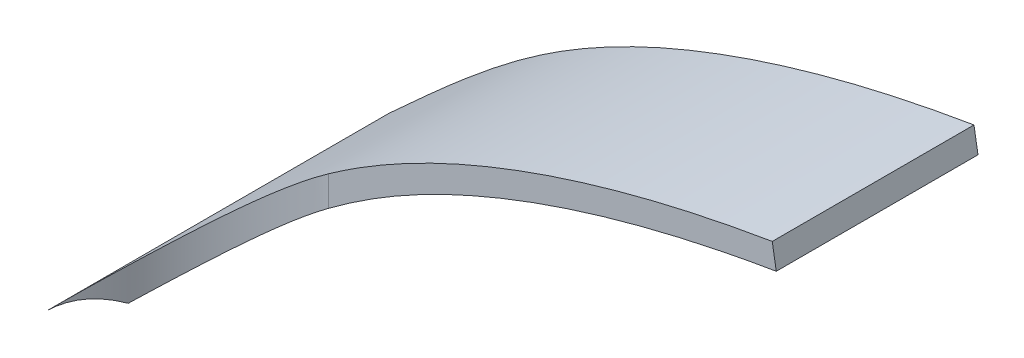
ISO-10303-21;
HEADER;
FILE_DESCRIPTION(('STEP AP214'),'2;1');
FILE_NAME('part.step','',(''),(''),'','','');
FILE_SCHEMA(('AUTOMOTIVE_DESIGN { 1 0 10303 214 1 1 1 1 }'));
ENDSEC;
DATA;
#1=APPLICATION_CONTEXT('core data for automotive mechanical design processes');
#2=APPLICATION_PROTOCOL_DEFINITION('international standard','automotive_design',2000,#1);
#3=PRODUCT_CONTEXT('',#1,'mechanical');
#4=PRODUCT('Part','Part','',(#3));
#5=PRODUCT_RELATED_PRODUCT_CATEGORY('part','',(#4));
#6=PRODUCT_DEFINITION_FORMATION('','',#4);
#7=PRODUCT_DEFINITION_CONTEXT('part definition',#1,'design');
#8=PRODUCT_DEFINITION('design','',#6,#7);
#9=PRODUCT_DEFINITION_SHAPE('','',#8);
#10=(LENGTH_UNIT() NAMED_UNIT(*) SI_UNIT(.MILLI.,.METRE.));
#11=(NAMED_UNIT(*) PLANE_ANGLE_UNIT() SI_UNIT($,.RADIAN.));
#12=(NAMED_UNIT(*) SI_UNIT($,.STERADIAN.) SOLID_ANGLE_UNIT());
#13=UNCERTAINTY_MEASURE_WITH_UNIT(LENGTH_MEASURE(1.E-05),#10,'distance_accuracy_value','');
#14=(GEOMETRIC_REPRESENTATION_CONTEXT(3) GLOBAL_UNCERTAINTY_ASSIGNED_CONTEXT((#13)) GLOBAL_UNIT_ASSIGNED_CONTEXT((#10,
#11,#12)) REPRESENTATION_CONTEXT('',''));
#15=CARTESIAN_POINT('',(0.,0.,0.));
#16=DIRECTION('',(0.,0.,1.));
#17=DIRECTION('',(1.,0.,0.));
#18=AXIS2_PLACEMENT_3D('',#15,#16,#17);
#19=CARTESIAN_POINT('',(0.,17.,10.));
#20=CARTESIAN_POINT('',(-1.92387366551589,16.6771904581056,10.));
#21=CARTESIAN_POINT('',(-5.62048772460826,15.8091540081434,10.));
#22=CARTESIAN_POINT('',(-10.6672018109282,13.5202587298351,10.));
#23=CARTESIAN_POINT('',(-13.2757006839175,11.1183251769361,10.));
#24=CARTESIAN_POINT('',(-14.5,10.,10.));
#25=B_SPLINE_CURVE_WITH_KNOTS('',3,(#19,#20,#21,#22,#23,#24),.UNSPECIFIED.,.F.,.F.,(4,1,1,4),
(0.,0.35691261152132,0.695162256038272,1.),.UNSPECIFIED.);
#26=DIRECTION('',(0.,0.,-1.));
#27=VECTOR('',#26,1.);
#28=SURFACE_OF_LINEAR_EXTRUSION('',#25,#27);
#29=CARTESIAN_POINT('',(0.,17.,5.));
#30=CARTESIAN_POINT('',(-1.92387366551589,16.6771904581056,5.));
#31=CARTESIAN_POINT('',(-5.62048772460826,15.8091540081434,5.));
#32=CARTESIAN_POINT('',(-10.6672018109282,13.5202587298351,5.));
#33=CARTESIAN_POINT('',(-13.2757006839175,11.1183251769361,5.));
#34=CARTESIAN_POINT('',(-14.5,10.,5.));
#35=B_SPLINE_CURVE_WITH_KNOTS('',3,(#29,#30,#31,#32,#33,#34),.UNSPECIFIED.,.F.,.F.,(4,1,1,4),
(0.,0.35691261152132,0.695162256038272,1.),.UNSPECIFIED.);
#36=CARTESIAN_POINT('',(0.,17.,5.));
#37=VERTEX_POINT('',#36);
#38=CARTESIAN_POINT('',(-11.,12.9510138024321,5.));
#39=VERTEX_POINT('',#38);
#40=EDGE_CURVE('E106',#37,#39,#35,.T.);
#41=ORIENTED_EDGE('',*,*,#40,.F.);
#42=DIRECTION('',(0.,0.,-1.));
#43=VECTOR('',#42,1.);
#44=CARTESIAN_POINT('',(0.,17.,10.));
#45=LINE('',#44,#43);
#46=CARTESIAN_POINT('',(0.,17.,0.));
#47=VERTEX_POINT('',#46);
#48=EDGE_CURVE('E64',#37,#47,#45,.T.);
#49=ORIENTED_EDGE('',*,*,#48,.T.);
#50=CARTESIAN_POINT('',(0.,17.,0.));
#51=CARTESIAN_POINT('',(-1.92387366551589,16.6771904581056,0.));
#52=CARTESIAN_POINT('',(-5.62048772460826,15.8091540081434,0.));
#53=CARTESIAN_POINT('',(-10.6672018109282,13.5202587298351,0.));
#54=CARTESIAN_POINT('',(-13.2757006839175,11.1183251769361,0.));
#55=CARTESIAN_POINT('',(-14.5,10.,0.));
#56=B_SPLINE_CURVE_WITH_KNOTS('',3,(#50,#51,#52,#53,#54,#55),.UNSPECIFIED.,.F.,.F.,(4,1,1,4),
(0.,0.35691261152132,0.695162256038272,1.),.UNSPECIFIED.);
#57=CARTESIAN_POINT('',(-14.5,10.,0.));
#58=VERTEX_POINT('',#57);
#59=EDGE_CURVE('E97',#47,#58,#56,.T.);
#60=ORIENTED_EDGE('',*,*,#59,.T.);
#61=DIRECTION('',(0.,0.,-1.));
#62=VECTOR('',#61,1.);
#63=CARTESIAN_POINT('',(-14.5,10.,10.));
#64=LINE('',#63,#62);
#65=CARTESIAN_POINT('',(-14.5,10.,8.5));
#66=VERTEX_POINT('',#65);
#67=EDGE_CURVE('E103',#66,#58,#64,.T.);
#68=ORIENTED_EDGE('',*,*,#67,.F.);
#69=CARTESIAN_POINT('',(-11.,12.9510138024321,5.));
#70=CARTESIAN_POINT('',(-11.1207210362699,12.8653711583919,5.00002826827791));
#71=CARTESIAN_POINT('',(-11.2403272775594,12.7782434289402,5.00624533008585));
#72=CARTESIAN_POINT('',(-11.476754067087,12.6019953960518,5.0305805153093));
#73=CARTESIAN_POINT('',(-11.5935758533821,12.5128760136582,5.048693243234));
#74=CARTESIAN_POINT('',(-11.8249299275096,12.3328098006543,5.09653891952134));
#75=CARTESIAN_POINT('',(-11.9394356862005,12.2418539860986,5.12636566677282));
#76=CARTESIAN_POINT('',(-12.1647725867874,12.0597652675851,5.19738482108524));
#77=CARTESIAN_POINT('',(-12.2756027599258,11.9686323235375,5.23858019827255));
#78=CARTESIAN_POINT('',(-12.495961058285,11.784830877574,5.33347739363892));
#79=CARTESIAN_POINT('',(-12.6053793329101,11.6921845458931,5.38747810515986));
#80=CARTESIAN_POINT('',(-12.8192345308152,11.5089613414559,5.50744041415602));
#81=CARTESIAN_POINT('',(-12.9236729643964,11.4183838456548,5.57339835568795));
#82=CARTESIAN_POINT('',(-13.1264668957097,11.2408894166357,5.71727880078463));
#83=CARTESIAN_POINT('',(-13.2248433687233,11.1539602366916,5.79515637116654));
#84=CARTESIAN_POINT('',(-13.4149896702411,10.9848087540005,5.96347459123423));
#85=CARTESIAN_POINT('',(-13.5067516858763,10.9025920402583,6.05392973970901));
#86=CARTESIAN_POINT('',(-13.7054212991926,10.7237740807538,6.27333455799499));
#87=CARTESIAN_POINT('',(-13.809904118662,10.6291296952763,6.40613464952464));
#88=CARTESIAN_POINT('',(-14.0018463319038,10.4547591154933,6.69212761183619));
#89=CARTESIAN_POINT('',(-14.0893454595565,10.3749981183666,6.84527143730946));
#90=CARTESIAN_POINT('',(-14.1978208297138,10.2760180196234,7.07537161537474));
#91=CARTESIAN_POINT('',(-14.2278403125432,10.2486125225477,7.14469448558603));
#92=CARTESIAN_POINT('',(-14.2837213020052,10.1975838702779,7.28634359467298));
#93=CARTESIAN_POINT('',(-14.3095840425239,10.1739595926765,7.3586689342455));
#94=CARTESIAN_POINT('',(-14.3567412035792,10.1308800165715,7.50589019190932));
#95=CARTESIAN_POINT('',(-14.3780418714875,10.1114190168541,7.58078242958234));
#96=CARTESIAN_POINT('',(-14.4157694759254,10.0769497862316,7.73276348733776));
#97=CARTESIAN_POINT('',(-14.4321975271549,10.0619405369076,7.80985180059805));
#98=CARTESIAN_POINT('',(-14.4638164892189,10.0330534875883,7.98786464857629));
#99=CARTESIAN_POINT('',(-14.4773365131398,10.0207025961968,8.08935137099003));
#100=CARTESIAN_POINT('',(-14.4909075660359,10.0083055195272,8.24268325861638));
#101=CARTESIAN_POINT('',(-14.494313121111,10.0051946728077,8.2940233938103));
#102=CARTESIAN_POINT('',(-14.4988602824024,10.0010410668929,8.39690420595051));
#103=CARTESIAN_POINT('',(-14.5000011370064,9.99999899428541,8.44844494378878));
#104=CARTESIAN_POINT('',(-14.5,10.,8.5));
#105=B_SPLINE_CURVE_WITH_KNOTS('',3,(#69,#70,#71,#72,#73,#74,#75,#76,#77,#78,#79,#80,#81,#82,
#83,#84,#85,#86,#87,#88,#89,#90,#91,#92,#93,#94,#95,#96,#97,#98,#99,#100,#101,#102,#103,#104),
.UNSPECIFIED.,.F.,.F.,(4,2,2,2,2,2,2,2,2,2,2,2,2,2,2,2,2,4),(0.,0.443831131453264,
0.887461094305583,1.33471828337571,1.78209243201193,2.24116628916176,2.70010001971193,
3.1573444920327,3.61512049087347,4.19413013202599,4.77176838801595,5.01264987494493,
5.25345972609925,5.49393766967352,5.73436055702475,6.04293873415208,6.19750132352687,
6.35211520079073),.UNSPECIFIED.);
#106=EDGE_CURVE('E90',#39,#66,#105,.T.);
#107=ORIENTED_EDGE('',*,*,#106,.F.);
#108=EDGE_LOOP('',(#41,#49,#60,#68,#107));
#109=FACE_BOUND('',#108,.T.);
#110=ADVANCED_FACE('F34',(#109),#28,.F.);
#111=CARTESIAN_POINT('',(-14.5,10.,10.));
#112=DIRECTION('',(0.738339333178899,0.674429410005924,0.));
#113=DIRECTION('',(-0.674429410005924,0.738339333178899,0.));
#114=AXIS2_PLACEMENT_3D('',#111,#112,#113);
#115=PLANE('',#114);
#116=CARTESIAN_POINT('',(-11.,6.16833485048725,8.5));
#117=DIRECTION('',(0.738339333178899,0.674429410005924,0.));
#118=DIRECTION('',(0.674429410005924,-0.738339333178899,0.));
#119=AXIS2_PLACEMENT_3D('',#116,#117,#118);
#120=ELLIPSE('',#119,5.1895720264768,3.5);
#121=CARTESIAN_POINT('',(-14.0953423539964,9.55699640009266,6.86633672026463));
#122=VERTEX_POINT('',#121);
#123=EDGE_CURVE('E93',#66,#122,#120,.F.);
#124=ORIENTED_EDGE('',*,*,#123,.F.);
#125=ORIENTED_EDGE('',*,*,#67,.T.);
#126=DIRECTION('',(0.674429410005924,-0.738339333178899,0.));
#127=VECTOR('',#126,1.);
#128=CARTESIAN_POINT('',(-14.5,10.,0.));
#129=LINE('',#128,#127);
#130=CARTESIAN_POINT('',(-14.0953423539964,9.55699640009266,0.));
#131=VERTEX_POINT('',#130);
#132=EDGE_CURVE('E122',#58,#131,#129,.T.);
#133=ORIENTED_EDGE('',*,*,#132,.T.);
#134=DIRECTION('',(0.,0.,-1.));
#135=VECTOR('',#134,1.);
#136=CARTESIAN_POINT('',(-14.0953423539964,9.55699640009266,10.));
#137=LINE('',#136,#135);
#138=EDGE_CURVE('E105',#122,#131,#137,.T.);
#139=ORIENTED_EDGE('',*,*,#138,.F.);
#140=EDGE_LOOP('',(#124,#125,#133,#139));
#141=FACE_BOUND('',#140,.T.);
#142=ADVANCED_FACE('F101',(#141),#115,.F.);
#143=CARTESIAN_POINT('',(-14.0953423539964,9.55699640009266,10.));
#144=CARTESIAN_POINT('',(-13.1018048706303,10.464534260551,10.));
#145=CARTESIAN_POINT('',(-11.591320399711,11.8561939183429,10.));
#146=CARTESIAN_POINT('',(-9.40820723150831,13.3081089476366,10.));
#147=CARTESIAN_POINT('',(-7.0317061016707,14.5122169088866,10.));
#148=CARTESIAN_POINT('',(-3.85682978935934,15.6200466139857,10.));
#149=CARTESIAN_POINT('',(-1.22479853157883,16.186101720185,10.));
#150=CARTESIAN_POINT('',(0.0992869079312353,16.4082719290811,10.));
#151=B_SPLINE_CURVE_WITH_KNOTS('',3,(#143,#144,#145,#146,#147,#148,#149,#150),.UNSPECIFIED.,.F.,
.F.,(4,1,1,1,1,4),(0.,0.25,0.375,0.5,0.75,1.),.UNSPECIFIED.);
#152=DIRECTION('',(0.,0.,-1.));
#153=VECTOR('',#152,1.);
#154=SURFACE_OF_LINEAR_EXTRUSION('',#151,#153);
#155=CARTESIAN_POINT('',(-14.0953423539964,9.55699640009266,5.));
#156=CARTESIAN_POINT('',(-13.1018048706303,10.464534260551,5.));
#157=CARTESIAN_POINT('',(-11.591320399711,11.8561939183429,5.));
#158=CARTESIAN_POINT('',(-9.40820723150831,13.3081089476366,5.));
#159=CARTESIAN_POINT('',(-7.0317061016707,14.5122169088866,5.));
#160=CARTESIAN_POINT('',(-3.85682978935934,15.6200466139857,5.));
#161=CARTESIAN_POINT('',(-1.22479853157883,16.186101720185,5.));
#162=CARTESIAN_POINT('',(0.0992869079312353,16.4082719290811,5.));
#163=B_SPLINE_CURVE_WITH_KNOTS('',3,(#155,#156,#157,#158,#159,#160,#161,#162),.UNSPECIFIED.,.F.,
.F.,(4,1,1,1,1,4),(0.,0.25,0.375,0.5,0.75,1.),.UNSPECIFIED.);
#164=CARTESIAN_POINT('',(-11.,12.2089439319963,5.));
#165=VERTEX_POINT('',#164);
#166=CARTESIAN_POINT('',(0.0992869079312353,16.4082719290811,5.));
#167=VERTEX_POINT('',#166);
#168=EDGE_CURVE('E56',#165,#167,#163,.T.);
#169=ORIENTED_EDGE('',*,*,#168,.F.);
#170=CARTESIAN_POINT('',(-14.0953423539964,9.55699640009266,6.86633672026463));
#171=CARTESIAN_POINT('',(-14.0458194250223,9.60222662670723,6.77252011867033));
#172=CARTESIAN_POINT('',(-13.9927702389718,9.65071033422737,6.68232065718503));
#173=CARTESIAN_POINT('',(-13.8806278330839,9.75318159689801,6.50937327742876));
#174=CARTESIAN_POINT('',(-13.8215462767262,9.80715853036013,6.42661154015417));
#175=CARTESIAN_POINT('',(-13.6375030692382,9.97515254476524,6.19063728545055));
#176=CARTESIAN_POINT('',(-13.5048725771575,10.0960304591183,6.0481460393731));
#177=CARTESIAN_POINT('',(-13.2765378997433,10.3028479969644,5.83883568803079));
#178=CARTESIAN_POINT('',(-13.1851890563489,10.3852903892996,5.76345773398701));
#179=CARTESIAN_POINT('',(-12.9974709985693,10.5537004243249,5.62357915715541));
#180=CARTESIAN_POINT('',(-12.9011011468029,10.639668514281,5.55907991976824));
#181=CARTESIAN_POINT('',(-12.7036045276751,10.814407601674,5.44041198308629));
#182=CARTESIAN_POINT('',(-12.6024559597356,10.9031906818327,5.38629778373705));
#183=CARTESIAN_POINT('',(-12.3963732819944,11.0821448882232,5.28859168925916));
#184=CARTESIAN_POINT('',(-12.2914390603082,11.1723160554344,5.24500010541835));
#185=CARTESIAN_POINT('',(-12.0903010517599,11.3428471972639,5.17263865724693));
#186=CARTESIAN_POINT('',(-11.9944574677828,11.4231596161254,5.14274830813209));
#187=CARTESIAN_POINT('',(-11.8003673883086,11.5835081677145,5.09126294392376));
#188=CARTESIAN_POINT('',(-11.7021213339525,11.6635443481304,5.06966641790718));
#189=CARTESIAN_POINT('',(-11.5043114757036,11.8220372360512,5.03508010393187));
#190=CARTESIAN_POINT('',(-11.4047668672594,11.9005016444149,5.02201627320461));
#191=CARTESIAN_POINT('',(-11.2037533904411,12.0559756176685,5.00448366757516));
#192=CARTESIAN_POINT('',(-11.1022838872031,12.1329846852375,5.00001778000483));
#193=CARTESIAN_POINT('',(-11.,12.2089439319963,5.));
#194=B_SPLINE_CURVE_WITH_KNOTS('',3,(#170,#171,#172,#173,#174,#175,#176,#177,#178,#179,#180,
#181,#182,#183,#184,#185,#186,#187,#188,#189,#190,#191,#192,#193),.UNSPECIFIED.,.F.,.F.,(4,2,2,
2,2,2,2,2,2,2,2,4),(0.,0.345569454127841,0.690482973221674,1.37445632078347,1.80692063879197,
2.23943998945951,2.67417056424176,3.10891399797178,3.49433369669287,3.87968314842761,
4.26164265345959,4.64373040446795),.UNSPECIFIED.);
#195=EDGE_CURVE('E11',#122,#165,#194,.T.);
#196=ORIENTED_EDGE('',*,*,#195,.F.);
#197=ORIENTED_EDGE('',*,*,#138,.T.);
#198=CARTESIAN_POINT('',(-14.0953423539964,9.55699640009266,0.));
#199=CARTESIAN_POINT('',(-13.1018048706303,10.464534260551,0.));
#200=CARTESIAN_POINT('',(-11.591320399711,11.8561939183429,0.));
#201=CARTESIAN_POINT('',(-9.40820723150831,13.3081089476366,0.));
#202=CARTESIAN_POINT('',(-7.0317061016707,14.5122169088866,0.));
#203=CARTESIAN_POINT('',(-3.85682978935934,15.6200466139857,0.));
#204=CARTESIAN_POINT('',(-1.22479853157883,16.186101720185,0.));
#205=CARTESIAN_POINT('',(0.0992869079312353,16.4082719290811,0.));
#206=B_SPLINE_CURVE_WITH_KNOTS('',3,(#198,#199,#200,#201,#202,#203,#204,#205),.UNSPECIFIED.,.F.,
.F.,(4,1,1,1,1,4),(0.,0.25,0.375,0.5,0.75,1.),.UNSPECIFIED.);
#207=CARTESIAN_POINT('',(0.0992869079312353,16.4082719290811,0.));
#208=VERTEX_POINT('',#207);
#209=EDGE_CURVE('E117',#131,#208,#206,.T.);
#210=ORIENTED_EDGE('',*,*,#209,.T.);
#211=DIRECTION('',(0.,0.,-1.));
#212=VECTOR('',#211,1.);
#213=CARTESIAN_POINT('',(0.0992869079312353,16.4082719290811,10.));
#214=LINE('',#213,#212);
#215=EDGE_CURVE('E110',#167,#208,#214,.T.);
#216=ORIENTED_EDGE('',*,*,#215,.F.);
#217=EDGE_LOOP('',(#169,#196,#197,#210,#216));
#218=FACE_BOUND('',#217,.T.);
#219=ADVANCED_FACE('F142',(#218),#154,.F.);
#220=CARTESIAN_POINT('',(0.0992869079312353,16.4082719290811,10.));
#221=DIRECTION('',(-0.986213451531573,-0.165478179885392,0.));
#222=DIRECTION('',(0.165478179885392,-0.986213451531573,0.));
#223=AXIS2_PLACEMENT_3D('',#220,#221,#222);
#224=PLANE('',#223);
#225=DIRECTION('',(-0.165478179885392,0.986213451531573,0.));
#226=VECTOR('',#225,1.);
#227=CARTESIAN_POINT('',(0.0992869079312353,16.4082719290811,5.));
#228=LINE('',#227,#226);
#229=EDGE_CURVE('E49',#167,#37,#228,.T.);
#230=ORIENTED_EDGE('',*,*,#229,.F.);
#231=ORIENTED_EDGE('',*,*,#215,.T.);
#232=DIRECTION('',(-0.165478179885392,0.986213451531573,0.));
#233=VECTOR('',#232,1.);
#234=CARTESIAN_POINT('',(0.0992869079312353,16.4082719290811,0.));
#235=LINE('',#234,#233);
#236=EDGE_CURVE('E115',#208,#47,#235,.T.);
#237=ORIENTED_EDGE('',*,*,#236,.T.);
#238=ORIENTED_EDGE('',*,*,#48,.F.);
#239=EDGE_LOOP('',(#230,#231,#237,#238));
#240=FACE_BOUND('',#239,.T.);
#241=ADVANCED_FACE('F146',(#240),#224,.F.);
#242=CARTESIAN_POINT('',(-7.85913355877318,14.7315402537369,0.));
#243=DIRECTION('',(0.,0.,-1.));
#244=DIRECTION('',(-1.,0.,0.));
#245=AXIS2_PLACEMENT_3D('',#242,#243,#244);
#246=PLANE('',#245);
#247=ORIENTED_EDGE('',*,*,#59,.F.);
#248=ORIENTED_EDGE('',*,*,#236,.F.);
#249=ORIENTED_EDGE('',*,*,#209,.F.);
#250=ORIENTED_EDGE('',*,*,#132,.F.);
#251=EDGE_LOOP('',(#247,#248,#249,#250));
#252=FACE_BOUND('',#251,.T.);
#253=ADVANCED_FACE('F162',(#252),#246,.T.);
#254=CARTESIAN_POINT('',(-11.,31.,8.5));
#255=DIRECTION('',(0.,-1.,0.));
#256=DIRECTION('',(0.,0.,-1.));
#257=AXIS2_PLACEMENT_3D('',#254,#255,#256);
#258=CYLINDRICAL_SURFACE('',#257,3.5);
#259=ORIENTED_EDGE('',*,*,#106,.T.);
#260=ORIENTED_EDGE('',*,*,#123,.T.);
#261=ORIENTED_EDGE('',*,*,#195,.T.);
#262=DIRECTION('',(0.,-1.,0.));
#263=VECTOR('',#262,1.);
#264=CARTESIAN_POINT('',(-11.,31.,5.));
#265=LINE('',#264,#263);
#266=EDGE_CURVE('E95',#39,#165,#265,.T.);
#267=ORIENTED_EDGE('',*,*,#266,.F.);
#268=EDGE_LOOP('',(#259,#260,#261,#267));
#269=FACE_BOUND('',#268,.T.);
#270=ADVANCED_FACE('F92',(#269),#258,.F.);
#271=CARTESIAN_POINT('',(2.54240303551038,31.,5.));
#272=DIRECTION('',(0.,0.,1.));
#273=DIRECTION('',(1.,0.,0.));
#274=AXIS2_PLACEMENT_3D('',#271,#272,#273);
#275=PLANE('',#274);
#276=ORIENTED_EDGE('',*,*,#40,.T.);
#277=ORIENTED_EDGE('',*,*,#266,.T.);
#278=ORIENTED_EDGE('',*,*,#168,.T.);
#279=ORIENTED_EDGE('',*,*,#229,.T.);
#280=EDGE_LOOP('',(#276,#277,#278,#279));
#281=FACE_BOUND('',#280,.T.);
#282=ADVANCED_FACE('F187',(#281),#275,.T.);
#283=CLOSED_SHELL('',(#110,#142,#219,#241,#253,#270,#282));
#284=MANIFOLD_SOLID_BREP('B2',#283);
#285=ADVANCED_BREP_SHAPE_REPRESENTATION('',(#18,#284),#14);
#286=SHAPE_DEFINITION_REPRESENTATION(#9,#285);
ENDSEC;
END-ISO-10303-21;
